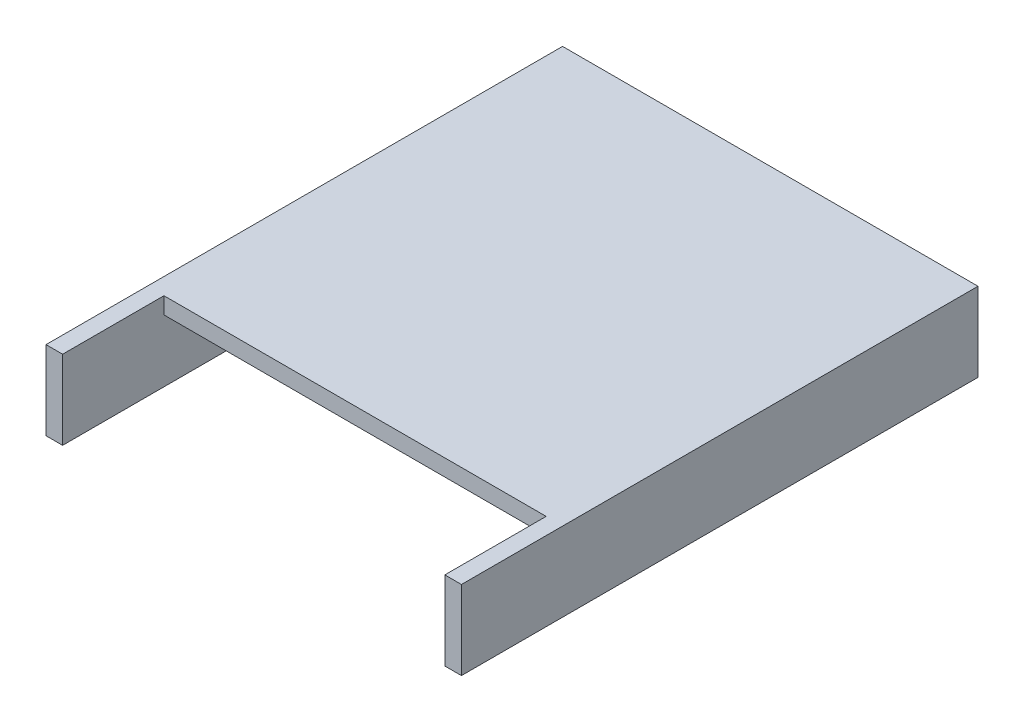
ISO-10303-21;
HEADER;
FILE_DESCRIPTION(('STEP AP214'),'2;1');
FILE_NAME('part.step','',(''),(''),'','','');
FILE_SCHEMA(('AUTOMOTIVE_DESIGN { 1 0 10303 214 1 1 1 1 }'));
ENDSEC;
DATA;
#1=APPLICATION_CONTEXT('core data for automotive mechanical design processes');
#2=APPLICATION_PROTOCOL_DEFINITION('international standard','automotive_design',2000,#1);
#3=PRODUCT_CONTEXT('',#1,'mechanical');
#4=PRODUCT('Part','Part','',(#3));
#5=PRODUCT_RELATED_PRODUCT_CATEGORY('part','',(#4));
#6=PRODUCT_DEFINITION_FORMATION('','',#4);
#7=PRODUCT_DEFINITION_CONTEXT('part definition',#1,'design');
#8=PRODUCT_DEFINITION('design','',#6,#7);
#9=PRODUCT_DEFINITION_SHAPE('','',#8);
#10=(LENGTH_UNIT() NAMED_UNIT(*) SI_UNIT(.MILLI.,.METRE.));
#11=(NAMED_UNIT(*) PLANE_ANGLE_UNIT() SI_UNIT($,.RADIAN.));
#12=(NAMED_UNIT(*) SI_UNIT($,.STERADIAN.) SOLID_ANGLE_UNIT());
#13=UNCERTAINTY_MEASURE_WITH_UNIT(LENGTH_MEASURE(1.E-05),#10,'distance_accuracy_value','');
#14=(GEOMETRIC_REPRESENTATION_CONTEXT(3) GLOBAL_UNCERTAINTY_ASSIGNED_CONTEXT((#13)) GLOBAL_UNIT_ASSIGNED_CONTEXT((#10,
#11,#12)) REPRESENTATION_CONTEXT('',''));
#15=CARTESIAN_POINT('',(0.,0.,0.));
#16=DIRECTION('',(0.,0.,1.));
#17=DIRECTION('',(1.,0.,0.));
#18=AXIS2_PLACEMENT_3D('',#15,#16,#17);
#19=CARTESIAN_POINT('',(0.,0.,99.95));
#20=DIRECTION('',(0.,0.,-1.));
#21=DIRECTION('',(-1.,0.,0.));
#22=AXIS2_PLACEMENT_3D('',#19,#20,#21);
#23=PLANE('',#22);
#24=DIRECTION('',(0.,-1.,0.));
#25=VECTOR('',#24,1.);
#26=CARTESIAN_POINT('',(52.6486486486487,38.6666666666667,99.95));
#27=LINE('',#26,#25);
#28=CARTESIAN_POINT('',(52.6486486486487,38.6666666666667,99.95));
#29=VERTEX_POINT('',#28);
#30=CARTESIAN_POINT('',(52.6486486486487,34.6666666666667,99.95));
#31=VERTEX_POINT('',#30);
#32=EDGE_CURVE('E186',#29,#31,#27,.T.);
#33=ORIENTED_EDGE('',*,*,#32,.F.);
#34=DIRECTION('',(1.,0.,0.));
#35=VECTOR('',#34,1.);
#36=CARTESIAN_POINT('',(-43.3513513513513,38.6666666666667,99.95));
#37=LINE('',#36,#35);
#38=CARTESIAN_POINT('',(-39.3513513513513,38.6666666666667,99.95));
#39=VERTEX_POINT('',#38);
#40=EDGE_CURVE('E116',#39,#29,#37,.T.);
#41=ORIENTED_EDGE('',*,*,#40,.F.);
#42=DIRECTION('',(0.,1.,0.));
#43=VECTOR('',#42,1.);
#44=CARTESIAN_POINT('',(-39.3513513513513,38.6666666666667,99.95));
#45=LINE('',#44,#43);
#46=CARTESIAN_POINT('',(-39.3513513513513,34.6666666666667,99.95));
#47=VERTEX_POINT('',#46);
#48=EDGE_CURVE('E11',#47,#39,#45,.T.);
#49=ORIENTED_EDGE('',*,*,#48,.F.);
#50=DIRECTION('',(1.,0.,0.));
#51=VECTOR('',#50,1.);
#52=CARTESIAN_POINT('',(-39.3513513513513,34.6666666666667,99.95));
#53=LINE('',#52,#51);
#54=EDGE_CURVE('E105',#47,#31,#53,.T.);
#55=ORIENTED_EDGE('',*,*,#54,.T.);
#56=EDGE_LOOP('',(#33,#41,#49,#55));
#57=FACE_BOUND('',#56,.T.);
#58=ADVANCED_FACE('F36',(#57),#23,.F.);
#59=CARTESIAN_POINT('',(-39.3513513513513,19.6666666666667,99.95));
#60=DIRECTION('',(-1.,0.,0.));
#61=DIRECTION('',(0.,0.,1.));
#62=AXIS2_PLACEMENT_3D('',#59,#60,#61);
#63=PLANE('',#62);
#64=DIRECTION('',(0.,1.,0.));
#65=VECTOR('',#64,1.);
#66=CARTESIAN_POINT('',(-39.3513513513513,19.6666666666667,0.));
#67=LINE('',#66,#65);
#68=CARTESIAN_POINT('',(-39.3513513513513,19.6666666666667,0.));
#69=VERTEX_POINT('',#68);
#70=CARTESIAN_POINT('',(-39.3513513513513,34.6666666666667,0.));
#71=VERTEX_POINT('',#70);
#72=EDGE_CURVE('E104',#69,#71,#67,.T.);
#73=ORIENTED_EDGE('',*,*,#72,.T.);
#74=DIRECTION('',(0.,0.,-1.));
#75=VECTOR('',#74,1.);
#76=CARTESIAN_POINT('',(-39.3513513513513,34.6666666666667,99.95));
#77=LINE('',#76,#75);
#78=EDGE_CURVE('E40',#47,#71,#77,.T.);
#79=ORIENTED_EDGE('',*,*,#78,.F.);
#80=ORIENTED_EDGE('',*,*,#48,.T.);
#81=DIRECTION('',(0.,0.,-1.));
#82=VECTOR('',#81,1.);
#83=CARTESIAN_POINT('',(-39.3513513513513,38.6666666666667,124.34));
#84=LINE('',#83,#82);
#85=CARTESIAN_POINT('',(-39.3513513513513,38.6666666666667,124.34));
#86=VERTEX_POINT('',#85);
#87=EDGE_CURVE('E139',#86,#39,#84,.T.);
#88=ORIENTED_EDGE('',*,*,#87,.F.);
#89=DIRECTION('',(0.,1.,0.));
#90=VECTOR('',#89,1.);
#91=CARTESIAN_POINT('',(-39.3513513513513,38.6666666666667,124.34));
#92=LINE('',#91,#90);
#93=CARTESIAN_POINT('',(-39.3513513513513,19.6666666666667,124.34));
#94=VERTEX_POINT('',#93);
#95=EDGE_CURVE('E196',#94,#86,#92,.T.);
#96=ORIENTED_EDGE('',*,*,#95,.F.);
#97=DIRECTION('',(0.,0.,-1.));
#98=VECTOR('',#97,1.);
#99=CARTESIAN_POINT('',(-39.3513513513513,19.6666666666667,99.95));
#100=LINE('',#99,#98);
#101=EDGE_CURVE('E95',#94,#69,#100,.T.);
#102=ORIENTED_EDGE('',*,*,#101,.T.);
#103=EDGE_LOOP('',(#73,#79,#80,#88,#96,#102));
#104=FACE_BOUND('',#103,.T.);
#105=ADVANCED_FACE('F38',(#104),#63,.F.);
#106=CARTESIAN_POINT('',(-39.3513513513513,34.6666666666667,99.95));
#107=DIRECTION('',(0.,1.,0.));
#108=DIRECTION('',(0.,0.,1.));
#109=AXIS2_PLACEMENT_3D('',#106,#107,#108);
#110=PLANE('',#109);
#111=DIRECTION('',(1.,0.,0.));
#112=VECTOR('',#111,1.);
#113=CARTESIAN_POINT('',(-39.3513513513513,34.6666666666667,0.));
#114=LINE('',#113,#112);
#115=CARTESIAN_POINT('',(52.6486486486487,34.6666666666667,0.));
#116=VERTEX_POINT('',#115);
#117=EDGE_CURVE('E135',#71,#116,#114,.T.);
#118=ORIENTED_EDGE('',*,*,#117,.T.);
#119=DIRECTION('',(0.,0.,-1.));
#120=VECTOR('',#119,1.);
#121=CARTESIAN_POINT('',(52.6486486486487,34.6666666666667,99.95));
#122=LINE('',#121,#120);
#123=EDGE_CURVE('E125',#31,#116,#122,.T.);
#124=ORIENTED_EDGE('',*,*,#123,.F.);
#125=ORIENTED_EDGE('',*,*,#54,.F.);
#126=ORIENTED_EDGE('',*,*,#78,.T.);
#127=EDGE_LOOP('',(#118,#124,#125,#126));
#128=FACE_BOUND('',#127,.T.);
#129=ADVANCED_FACE('F134',(#128),#110,.F.);
#130=CARTESIAN_POINT('',(52.6486486486487,19.6666666666667,99.95));
#131=DIRECTION('',(-1.,0.,0.));
#132=DIRECTION('',(0.,0.,1.));
#133=AXIS2_PLACEMENT_3D('',#130,#131,#132);
#134=PLANE('',#133);
#135=DIRECTION('',(0.,1.,0.));
#136=VECTOR('',#135,1.);
#137=CARTESIAN_POINT('',(52.6486486486487,19.6666666666667,0.));
#138=LINE('',#137,#136);
#139=CARTESIAN_POINT('',(52.6486486486487,19.6666666666667,0.));
#140=VERTEX_POINT('',#139);
#141=EDGE_CURVE('E141',#140,#116,#138,.T.);
#142=ORIENTED_EDGE('',*,*,#141,.F.);
#143=DIRECTION('',(0.,0.,-1.));
#144=VECTOR('',#143,1.);
#145=CARTESIAN_POINT('',(52.6486486486487,19.6666666666667,99.95));
#146=LINE('',#145,#144);
#147=CARTESIAN_POINT('',(52.6486486486487,19.6666666666667,124.34));
#148=VERTEX_POINT('',#147);
#149=EDGE_CURVE('E124',#148,#140,#146,.T.);
#150=ORIENTED_EDGE('',*,*,#149,.F.);
#151=DIRECTION('',(0.,-1.,0.));
#152=VECTOR('',#151,1.);
#153=CARTESIAN_POINT('',(52.6486486486487,38.6666666666667,124.34));
#154=LINE('',#153,#152);
#155=CARTESIAN_POINT('',(52.6486486486487,38.6666666666667,124.34));
#156=VERTEX_POINT('',#155);
#157=EDGE_CURVE('E178',#156,#148,#154,.T.);
#158=ORIENTED_EDGE('',*,*,#157,.F.);
#159=DIRECTION('',(0.,0.,-1.));
#160=VECTOR('',#159,1.);
#161=CARTESIAN_POINT('',(52.6486486486487,38.6666666666667,124.34));
#162=LINE('',#161,#160);
#163=EDGE_CURVE('E172',#156,#29,#162,.T.);
#164=ORIENTED_EDGE('',*,*,#163,.T.);
#165=ORIENTED_EDGE('',*,*,#32,.T.);
#166=ORIENTED_EDGE('',*,*,#123,.T.);
#167=EDGE_LOOP('',(#142,#150,#158,#164,#165,#166));
#168=FACE_BOUND('',#167,.T.);
#169=ADVANCED_FACE('F216',(#168),#134,.T.);
#170=CARTESIAN_POINT('',(52.6486486486487,19.6666666666667,99.95));
#171=DIRECTION('',(0.,1.,0.));
#172=DIRECTION('',(0.,0.,1.));
#173=AXIS2_PLACEMENT_3D('',#170,#171,#172);
#174=PLANE('',#173);
#175=DIRECTION('',(1.,0.,0.));
#176=VECTOR('',#175,1.);
#177=CARTESIAN_POINT('',(52.6486486486487,19.6666666666667,0.));
#178=LINE('',#177,#176);
#179=CARTESIAN_POINT('',(56.6486486486487,19.6666666666667,0.));
#180=VERTEX_POINT('',#179);
#181=EDGE_CURVE('E150',#140,#180,#178,.T.);
#182=ORIENTED_EDGE('',*,*,#181,.T.);
#183=DIRECTION('',(0.,0.,-1.));
#184=VECTOR('',#183,1.);
#185=CARTESIAN_POINT('',(56.6486486486487,19.6666666666667,99.95));
#186=LINE('',#185,#184);
#187=CARTESIAN_POINT('',(56.6486486486487,19.6666666666667,124.34));
#188=VERTEX_POINT('',#187);
#189=EDGE_CURVE('E121',#188,#180,#186,.T.);
#190=ORIENTED_EDGE('',*,*,#189,.F.);
#191=DIRECTION('',(1.,0.,0.));
#192=VECTOR('',#191,1.);
#193=CARTESIAN_POINT('',(56.6486486486487,19.6666666666667,124.34));
#194=LINE('',#193,#192);
#195=EDGE_CURVE('E185',#148,#188,#194,.T.);
#196=ORIENTED_EDGE('',*,*,#195,.F.);
#197=ORIENTED_EDGE('',*,*,#149,.T.);
#198=EDGE_LOOP('',(#182,#190,#196,#197));
#199=FACE_BOUND('',#198,.T.);
#200=ADVANCED_FACE('F218',(#199),#174,.F.);
#201=CARTESIAN_POINT('',(56.6486486486487,19.6666666666667,99.95));
#202=DIRECTION('',(-1.,0.,0.));
#203=DIRECTION('',(0.,0.,1.));
#204=AXIS2_PLACEMENT_3D('',#201,#202,#203);
#205=PLANE('',#204);
#206=DIRECTION('',(0.,1.,0.));
#207=VECTOR('',#206,1.);
#208=CARTESIAN_POINT('',(56.6486486486487,19.6666666666667,0.));
#209=LINE('',#208,#207);
#210=CARTESIAN_POINT('',(56.6486486486487,38.6666666666667,0.));
#211=VERTEX_POINT('',#210);
#212=EDGE_CURVE('E112',#180,#211,#209,.T.);
#213=ORIENTED_EDGE('',*,*,#212,.T.);
#214=DIRECTION('',(0.,0.,-1.));
#215=VECTOR('',#214,1.);
#216=CARTESIAN_POINT('',(56.6486486486487,38.6666666666667,99.95));
#217=LINE('',#216,#215);
#218=CARTESIAN_POINT('',(56.6486486486487,38.6666666666667,124.34));
#219=VERTEX_POINT('',#218);
#220=EDGE_CURVE('E119',#219,#211,#217,.T.);
#221=ORIENTED_EDGE('',*,*,#220,.F.);
#222=DIRECTION('',(0.,1.,0.));
#223=VECTOR('',#222,1.);
#224=CARTESIAN_POINT('',(56.6486486486487,38.6666666666667,124.34));
#225=LINE('',#224,#223);
#226=EDGE_CURVE('E179',#188,#219,#225,.T.);
#227=ORIENTED_EDGE('',*,*,#226,.F.);
#228=ORIENTED_EDGE('',*,*,#189,.T.);
#229=EDGE_LOOP('',(#213,#221,#227,#228));
#230=FACE_BOUND('',#229,.T.);
#231=ADVANCED_FACE('F155',(#230),#205,.F.);
#232=CARTESIAN_POINT('',(-43.3513513513513,38.6666666666667,99.95));
#233=DIRECTION('',(0.,1.,0.));
#234=DIRECTION('',(0.,0.,1.));
#235=AXIS2_PLACEMENT_3D('',#232,#233,#234);
#236=PLANE('',#235);
#237=DIRECTION('',(1.,0.,0.));
#238=VECTOR('',#237,1.);
#239=CARTESIAN_POINT('',(-43.3513513513513,38.6666666666667,0.));
#240=LINE('',#239,#238);
#241=CARTESIAN_POINT('',(-43.3513513513513,38.6666666666667,0.));
#242=VERTEX_POINT('',#241);
#243=EDGE_CURVE('E110',#242,#211,#240,.T.);
#244=ORIENTED_EDGE('',*,*,#243,.F.);
#245=DIRECTION('',(0.,0.,-1.));
#246=VECTOR('',#245,1.);
#247=CARTESIAN_POINT('',(-43.3513513513513,38.6666666666667,99.95));
#248=LINE('',#247,#246);
#249=CARTESIAN_POINT('',(-43.3513513513513,38.6666666666667,124.34));
#250=VERTEX_POINT('',#249);
#251=EDGE_CURVE('E94',#250,#242,#248,.T.);
#252=ORIENTED_EDGE('',*,*,#251,.F.);
#253=DIRECTION('',(-1.,0.,0.));
#254=VECTOR('',#253,1.);
#255=CARTESIAN_POINT('',(-43.3513513513513,38.6666666666667,124.34));
#256=LINE('',#255,#254);
#257=EDGE_CURVE('E144',#86,#250,#256,.T.);
#258=ORIENTED_EDGE('',*,*,#257,.F.);
#259=ORIENTED_EDGE('',*,*,#87,.T.);
#260=ORIENTED_EDGE('',*,*,#40,.T.);
#261=ORIENTED_EDGE('',*,*,#163,.F.);
#262=DIRECTION('',(-1.,0.,0.));
#263=VECTOR('',#262,1.);
#264=CARTESIAN_POINT('',(56.6486486486487,38.6666666666667,124.34));
#265=LINE('',#264,#263);
#266=EDGE_CURVE('E167',#219,#156,#265,.T.);
#267=ORIENTED_EDGE('',*,*,#266,.F.);
#268=ORIENTED_EDGE('',*,*,#220,.T.);
#269=EDGE_LOOP('',(#244,#252,#258,#259,#260,#261,#267,#268));
#270=FACE_BOUND('',#269,.T.);
#271=ADVANCED_FACE('F162',(#270),#236,.T.);
#272=CARTESIAN_POINT('',(-43.3513513513513,19.6666666666667,99.95));
#273=DIRECTION('',(-1.,0.,0.));
#274=DIRECTION('',(0.,0.,1.));
#275=AXIS2_PLACEMENT_3D('',#272,#273,#274);
#276=PLANE('',#275);
#277=DIRECTION('',(0.,1.,0.));
#278=VECTOR('',#277,1.);
#279=CARTESIAN_POINT('',(-43.3513513513513,19.6666666666667,0.));
#280=LINE('',#279,#278);
#281=CARTESIAN_POINT('',(-43.3513513513513,19.6666666666667,0.));
#282=VERTEX_POINT('',#281);
#283=EDGE_CURVE('E102',#282,#242,#280,.T.);
#284=ORIENTED_EDGE('',*,*,#283,.F.);
#285=DIRECTION('',(0.,0.,-1.));
#286=VECTOR('',#285,1.);
#287=CARTESIAN_POINT('',(-43.3513513513513,19.6666666666667,99.95));
#288=LINE('',#287,#286);
#289=CARTESIAN_POINT('',(-43.3513513513513,19.6666666666667,124.34));
#290=VERTEX_POINT('',#289);
#291=EDGE_CURVE('E81',#290,#282,#288,.T.);
#292=ORIENTED_EDGE('',*,*,#291,.F.);
#293=DIRECTION('',(0.,-1.,0.));
#294=VECTOR('',#293,1.);
#295=CARTESIAN_POINT('',(-43.3513513513513,38.6666666666667,124.34));
#296=LINE('',#295,#294);
#297=EDGE_CURVE('E193',#250,#290,#296,.T.);
#298=ORIENTED_EDGE('',*,*,#297,.F.);
#299=ORIENTED_EDGE('',*,*,#251,.T.);
#300=EDGE_LOOP('',(#284,#292,#298,#299));
#301=FACE_BOUND('',#300,.T.);
#302=ADVANCED_FACE('F107',(#301),#276,.T.);
#303=CARTESIAN_POINT('',(-43.3513513513513,19.6666666666667,99.95));
#304=DIRECTION('',(0.,1.,0.));
#305=DIRECTION('',(0.,0.,1.));
#306=AXIS2_PLACEMENT_3D('',#303,#304,#305);
#307=PLANE('',#306);
#308=DIRECTION('',(1.,0.,0.));
#309=VECTOR('',#308,1.);
#310=CARTESIAN_POINT('',(-43.3513513513513,19.6666666666667,0.));
#311=LINE('',#310,#309);
#312=EDGE_CURVE('E85',#282,#69,#311,.T.);
#313=ORIENTED_EDGE('',*,*,#312,.T.);
#314=ORIENTED_EDGE('',*,*,#101,.F.);
#315=DIRECTION('',(1.,0.,0.));
#316=VECTOR('',#315,1.);
#317=CARTESIAN_POINT('',(-43.3513513513513,19.6666666666667,124.34));
#318=LINE('',#317,#316);
#319=EDGE_CURVE('E89',#290,#94,#318,.T.);
#320=ORIENTED_EDGE('',*,*,#319,.F.);
#321=ORIENTED_EDGE('',*,*,#291,.T.);
#322=EDGE_LOOP('',(#313,#314,#320,#321));
#323=FACE_BOUND('',#322,.T.);
#324=ADVANCED_FACE('F83',(#323),#307,.F.);
#325=CARTESIAN_POINT('',(0.,0.,0.));
#326=DIRECTION('',(0.,0.,-1.));
#327=DIRECTION('',(-1.,0.,0.));
#328=AXIS2_PLACEMENT_3D('',#325,#326,#327);
#329=PLANE('',#328);
#330=ORIENTED_EDGE('',*,*,#72,.F.);
#331=ORIENTED_EDGE('',*,*,#312,.F.);
#332=ORIENTED_EDGE('',*,*,#283,.T.);
#333=ORIENTED_EDGE('',*,*,#243,.T.);
#334=ORIENTED_EDGE('',*,*,#212,.F.);
#335=ORIENTED_EDGE('',*,*,#181,.F.);
#336=ORIENTED_EDGE('',*,*,#141,.T.);
#337=ORIENTED_EDGE('',*,*,#117,.F.);
#338=EDGE_LOOP('',(#330,#331,#332,#333,#334,#335,#336,#337));
#339=FACE_BOUND('',#338,.T.);
#340=ADVANCED_FACE('F100',(#339),#329,.T.);
#341=CARTESIAN_POINT('',(0.,0.,124.34));
#342=DIRECTION('',(0.,0.,1.));
#343=DIRECTION('',(1.,0.,0.));
#344=AXIS2_PLACEMENT_3D('',#341,#342,#343);
#345=PLANE('',#344);
#346=ORIENTED_EDGE('',*,*,#297,.T.);
#347=ORIENTED_EDGE('',*,*,#319,.T.);
#348=ORIENTED_EDGE('',*,*,#95,.T.);
#349=ORIENTED_EDGE('',*,*,#257,.T.);
#350=EDGE_LOOP('',(#346,#347,#348,#349));
#351=FACE_BOUND('',#350,.T.);
#352=ADVANCED_FACE('F207',(#351),#345,.T.);
#353=CARTESIAN_POINT('',(0.,0.,124.34));
#354=DIRECTION('',(0.,0.,-1.));
#355=DIRECTION('',(-1.,0.,0.));
#356=AXIS2_PLACEMENT_3D('',#353,#354,#355);
#357=PLANE('',#356);
#358=ORIENTED_EDGE('',*,*,#226,.T.);
#359=ORIENTED_EDGE('',*,*,#266,.T.);
#360=ORIENTED_EDGE('',*,*,#157,.T.);
#361=ORIENTED_EDGE('',*,*,#195,.T.);
#362=EDGE_LOOP('',(#358,#359,#360,#361));
#363=FACE_BOUND('',#362,.T.);
#364=ADVANCED_FACE('F182',(#363),#357,.F.);
#365=CLOSED_SHELL('',(#58,#105,#129,#169,#200,#231,#271,#302,#324,#340,#352,#364));
#366=MANIFOLD_SOLID_BREP('B2',#365);
#367=ADVANCED_BREP_SHAPE_REPRESENTATION('',(#18,#366),#14);
#368=SHAPE_DEFINITION_REPRESENTATION(#9,#367);
ENDSEC;
END-ISO-10303-21;
